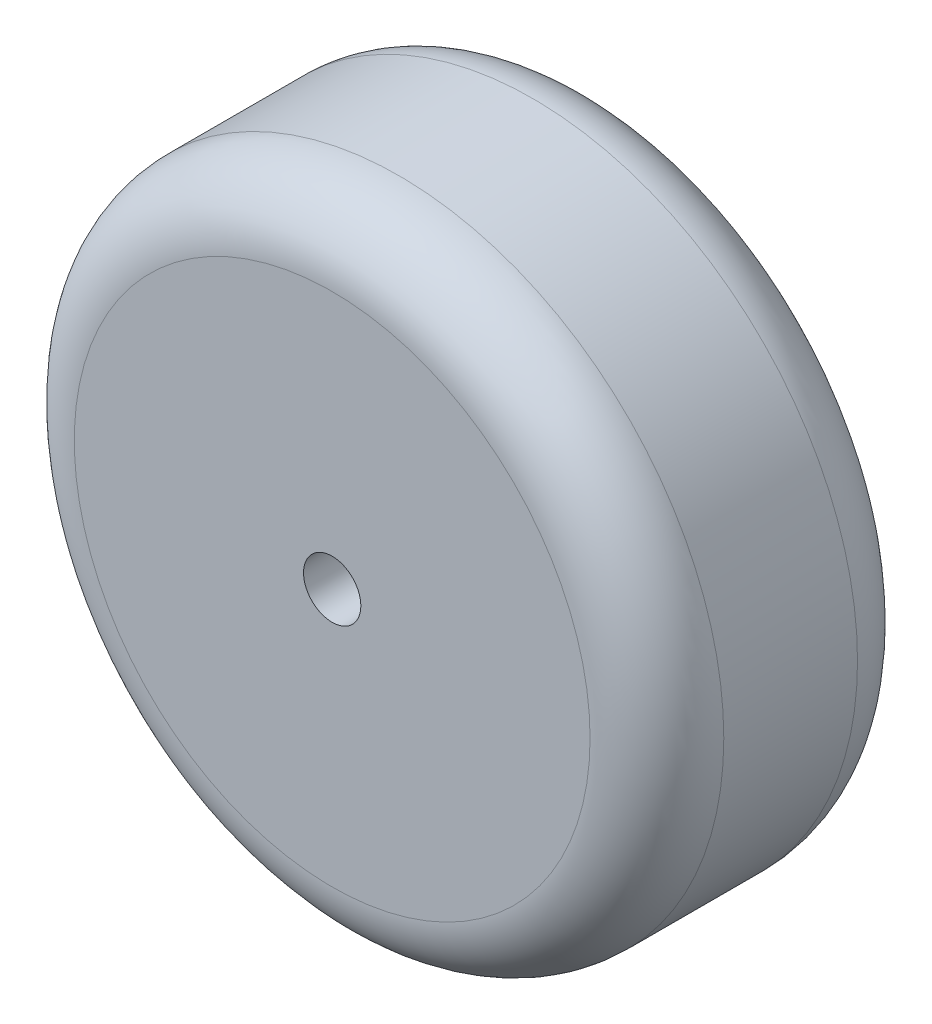
ISO-10303-21;
HEADER;
FILE_DESCRIPTION(('STEP AP214'),'2;1');
FILE_NAME('part.step','',(''),(''),'','','');
FILE_SCHEMA(('AUTOMOTIVE_DESIGN { 1 0 10303 214 1 1 1 1 }'));
ENDSEC;
DATA;
#1=APPLICATION_CONTEXT('core data for automotive mechanical design processes');
#2=APPLICATION_PROTOCOL_DEFINITION('international standard','automotive_design',2000,#1);
#3=PRODUCT_CONTEXT('',#1,'mechanical');
#4=PRODUCT('Part','Part','',(#3));
#5=PRODUCT_RELATED_PRODUCT_CATEGORY('part','',(#4));
#6=PRODUCT_DEFINITION_FORMATION('','',#4);
#7=PRODUCT_DEFINITION_CONTEXT('part definition',#1,'design');
#8=PRODUCT_DEFINITION('design','',#6,#7);
#9=PRODUCT_DEFINITION_SHAPE('','',#8);
#10=(LENGTH_UNIT() NAMED_UNIT(*) SI_UNIT(.MILLI.,.METRE.));
#11=(NAMED_UNIT(*) PLANE_ANGLE_UNIT() SI_UNIT($,.RADIAN.));
#12=(NAMED_UNIT(*) SI_UNIT($,.STERADIAN.) SOLID_ANGLE_UNIT());
#13=UNCERTAINTY_MEASURE_WITH_UNIT(LENGTH_MEASURE(1.E-05),#10,'distance_accuracy_value','');
#14=(GEOMETRIC_REPRESENTATION_CONTEXT(3) GLOBAL_UNCERTAINTY_ASSIGNED_CONTEXT((#13)) GLOBAL_UNIT_ASSIGNED_CONTEXT((#10,
#11,#12)) REPRESENTATION_CONTEXT('',''));
#15=CARTESIAN_POINT('',(0.,0.,0.));
#16=DIRECTION('',(0.,0.,1.));
#17=DIRECTION('',(1.,0.,0.));
#18=AXIS2_PLACEMENT_3D('',#15,#16,#17);
#19=CARTESIAN_POINT('',(-5.79563540269345,6.53236871659516,28.));
#20=DIRECTION('',(0.,0.,1.));
#21=DIRECTION('',(1.,0.,0.));
#22=AXIS2_PLACEMENT_3D('',#19,#20,#21);
#23=PLANE('',#22);
#24=CARTESIAN_POINT('',(-5.79563540269345,6.53236871659516,28.));
#25=DIRECTION('',(0.,0.,1.));
#26=DIRECTION('',(1.,0.,0.));
#27=AXIS2_PLACEMENT_3D('',#24,#25,#26);
#28=CIRCLE('',#27,27.);
#29=CARTESIAN_POINT('',(21.2043645973066,6.53236871659516,28.));
#30=VERTEX_POINT('',#29);
#31=EDGE_CURVE('E54',#30,#30,#28,.T.);
#32=ORIENTED_EDGE('',*,*,#31,.T.);
#33=EDGE_LOOP('',(#32));
#34=FACE_BOUND('',#33,.T.);
#35=CARTESIAN_POINT('',(-5.79563540269345,6.53236871659516,28.));
#36=DIRECTION('',(0.,0.,1.));
#37=DIRECTION('',(1.,0.,0.));
#38=AXIS2_PLACEMENT_3D('',#35,#36,#37);
#39=CIRCLE('',#38,3.);
#40=CARTESIAN_POINT('',(-2.79563540269345,6.53236871659516,28.));
#41=VERTEX_POINT('',#40);
#42=EDGE_CURVE('E59',#41,#41,#39,.T.);
#43=ORIENTED_EDGE('',*,*,#42,.F.);
#44=EDGE_LOOP('',(#43));
#45=FACE_BOUND('',#44,.T.);
#46=ADVANCED_FACE('F39',(#34,#45),#23,.T.);
#47=CARTESIAN_POINT('',(-5.79563540269345,6.53236871659516,0.));
#48=DIRECTION('',(0.,0.,1.));
#49=DIRECTION('',(1.,0.,0.));
#50=AXIS2_PLACEMENT_3D('',#47,#48,#49);
#51=PLANE('',#50);
#52=CARTESIAN_POINT('',(-5.79563540269345,6.53236871659516,0.));
#53=DIRECTION('',(0.,0.,1.));
#54=DIRECTION('',(1.,0.,0.));
#55=AXIS2_PLACEMENT_3D('',#52,#53,#54);
#56=CIRCLE('',#55,27.);
#57=CARTESIAN_POINT('',(21.2043645973066,6.53236871659516,0.));
#58=VERTEX_POINT('',#57);
#59=EDGE_CURVE('E11',#58,#58,#56,.F.);
#60=ORIENTED_EDGE('',*,*,#59,.T.);
#61=EDGE_LOOP('',(#60));
#62=FACE_BOUND('',#61,.T.);
#63=CARTESIAN_POINT('',(-5.79563540269345,6.53236871659516,0.));
#64=DIRECTION('',(0.,0.,1.));
#65=DIRECTION('',(1.,0.,0.));
#66=AXIS2_PLACEMENT_3D('',#63,#64,#65);
#67=CIRCLE('',#66,3.);
#68=CARTESIAN_POINT('',(-2.79563540269345,6.53236871659516,0.));
#69=VERTEX_POINT('',#68);
#70=EDGE_CURVE('E60',#69,#69,#67,.T.);
#71=ORIENTED_EDGE('',*,*,#70,.T.);
#72=EDGE_LOOP('',(#71));
#73=FACE_BOUND('',#72,.T.);
#74=ADVANCED_FACE('F70',(#62,#73),#51,.F.);
#75=CARTESIAN_POINT('',(-5.79563540269345,6.53236871659516,28.));
#76=DIRECTION('',(0.,0.,-1.));
#77=DIRECTION('',(-1.,0.,0.));
#78=AXIS2_PLACEMENT_3D('',#75,#76,#77);
#79=CYLINDRICAL_SURFACE('',#78,34.);
#80=CARTESIAN_POINT('',(-5.79563540269345,6.53236871659516,21.));
#81=DIRECTION('',(0.,0.,1.));
#82=DIRECTION('',(1.,0.,0.));
#83=AXIS2_PLACEMENT_3D('',#80,#81,#82);
#84=CIRCLE('',#83,34.);
#85=CARTESIAN_POINT('',(28.2043645973066,6.53236871659516,21.));
#86=VERTEX_POINT('',#85);
#87=EDGE_CURVE('E46',#86,#86,#84,.F.);
#88=ORIENTED_EDGE('',*,*,#87,.T.);
#89=EDGE_LOOP('',(#88));
#90=FACE_BOUND('',#89,.T.);
#91=CARTESIAN_POINT('',(-5.79563540269345,6.53236871659516,7.));
#92=DIRECTION('',(0.,0.,1.));
#93=DIRECTION('',(1.,0.,0.));
#94=AXIS2_PLACEMENT_3D('',#91,#92,#93);
#95=CIRCLE('',#94,34.);
#96=CARTESIAN_POINT('',(28.2043645973066,6.53236871659516,7.));
#97=VERTEX_POINT('',#96);
#98=EDGE_CURVE('E50',#97,#97,#95,.T.);
#99=ORIENTED_EDGE('',*,*,#98,.T.);
#100=EDGE_LOOP('',(#99));
#101=FACE_BOUND('',#100,.T.);
#102=ADVANCED_FACE('F76',(#90,#101),#79,.T.);
#103=CARTESIAN_POINT('',(-5.79563540269345,6.53236871659516,28.));
#104=DIRECTION('',(0.,0.,-1.));
#105=DIRECTION('',(-1.,0.,0.));
#106=AXIS2_PLACEMENT_3D('',#103,#104,#105);
#107=CYLINDRICAL_SURFACE('',#106,3.);
#108=ORIENTED_EDGE('',*,*,#42,.T.);
#109=EDGE_LOOP('',(#108));
#110=FACE_BOUND('',#109,.T.);
#111=ORIENTED_EDGE('',*,*,#70,.F.);
#112=EDGE_LOOP('',(#111));
#113=FACE_BOUND('',#112,.T.);
#114=ADVANCED_FACE('F66',(#110,#113),#107,.F.);
#115=CARTESIAN_POINT('',(-5.79563540269345,6.53236871659516,21.));
#116=DIRECTION('',(0.,0.,1.));
#117=DIRECTION('',(1.,0.,0.));
#118=AXIS2_PLACEMENT_3D('',#115,#116,#117);
#119=TOROIDAL_SURFACE('',#118,27.,7.);
#120=ORIENTED_EDGE('',*,*,#87,.F.);
#121=EDGE_LOOP('',(#120));
#122=FACE_BOUND('',#121,.T.);
#123=ORIENTED_EDGE('',*,*,#31,.F.);
#124=EDGE_LOOP('',(#123));
#125=FACE_BOUND('',#124,.T.);
#126=ADVANCED_FACE('F81',(#122,#125),#119,.T.);
#127=CARTESIAN_POINT('',(-5.79563540269345,6.53236871659516,7.));
#128=DIRECTION('',(0.,0.,1.));
#129=DIRECTION('',(1.,0.,0.));
#130=AXIS2_PLACEMENT_3D('',#127,#128,#129);
#131=TOROIDAL_SURFACE('',#130,27.,7.);
#132=ORIENTED_EDGE('',*,*,#59,.F.);
#133=EDGE_LOOP('',(#132));
#134=FACE_BOUND('',#133,.T.);
#135=ORIENTED_EDGE('',*,*,#98,.F.);
#136=EDGE_LOOP('',(#135));
#137=FACE_BOUND('',#136,.T.);
#138=ADVANCED_FACE('F41',(#134,#137),#131,.T.);
#139=CLOSED_SHELL('',(#46,#74,#102,#114,#126,#138));
#140=MANIFOLD_SOLID_BREP('B2',#139);
#141=ADVANCED_BREP_SHAPE_REPRESENTATION('',(#18,#140),#14);
#142=SHAPE_DEFINITION_REPRESENTATION(#9,#141);
ENDSEC;
END-ISO-10303-21;
